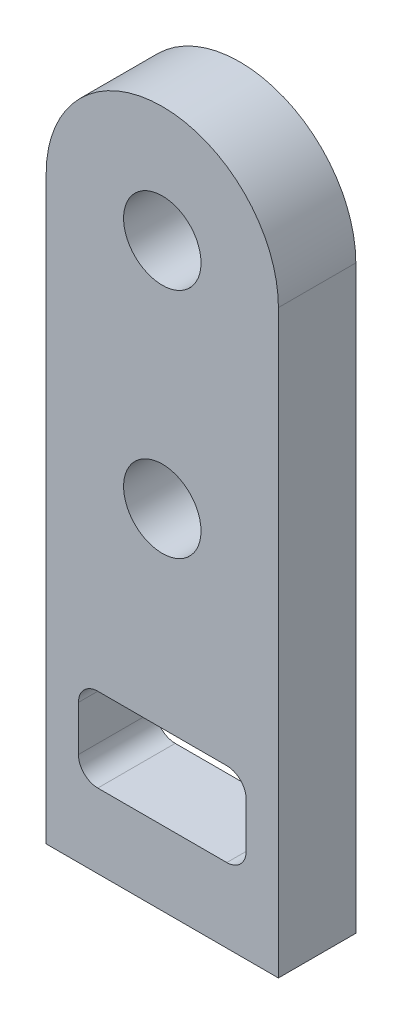
ISO-10303-21;
HEADER;
FILE_DESCRIPTION(('STEP AP214'),'2;1');
FILE_NAME('part.step','',(''),(''),'','','');
FILE_SCHEMA(('AUTOMOTIVE_DESIGN { 1 0 10303 214 1 1 1 1 }'));
ENDSEC;
DATA;
#1=APPLICATION_CONTEXT('core data for automotive mechanical design processes');
#2=APPLICATION_PROTOCOL_DEFINITION('international standard','automotive_design',2000,#1);
#3=PRODUCT_CONTEXT('',#1,'mechanical');
#4=PRODUCT('Part','Part','',(#3));
#5=PRODUCT_RELATED_PRODUCT_CATEGORY('part','',(#4));
#6=PRODUCT_DEFINITION_FORMATION('','',#4);
#7=PRODUCT_DEFINITION_CONTEXT('part definition',#1,'design');
#8=PRODUCT_DEFINITION('design','',#6,#7);
#9=PRODUCT_DEFINITION_SHAPE('','',#8);
#10=(LENGTH_UNIT() NAMED_UNIT(*) SI_UNIT(.MILLI.,.METRE.));
#11=(NAMED_UNIT(*) PLANE_ANGLE_UNIT() SI_UNIT($,.RADIAN.));
#12=(NAMED_UNIT(*) SI_UNIT($,.STERADIAN.) SOLID_ANGLE_UNIT());
#13=UNCERTAINTY_MEASURE_WITH_UNIT(LENGTH_MEASURE(1.E-05),#10,'distance_accuracy_value','');
#14=(GEOMETRIC_REPRESENTATION_CONTEXT(3) GLOBAL_UNCERTAINTY_ASSIGNED_CONTEXT((#13)) GLOBAL_UNIT_ASSIGNED_CONTEXT((#10,
#11,#12)) REPRESENTATION_CONTEXT('',''));
#15=CARTESIAN_POINT('',(0.,0.,0.));
#16=DIRECTION('',(0.,0.,1.));
#17=DIRECTION('',(1.,0.,0.));
#18=AXIS2_PLACEMENT_3D('',#15,#16,#17);
#19=CARTESIAN_POINT('',(155.0913565475,221.4940368431,3.));
#20=DIRECTION('',(0.,0.,1.));
#21=DIRECTION('',(1.,0.,0.));
#22=AXIS2_PLACEMENT_3D('',#19,#20,#21);
#23=PLANE('',#22);
#24=DIRECTION('',(1.,0.,0.));
#25=VECTOR('',#24,1.);
#26=CARTESIAN_POINT('',(157.5913565475,201.8690368431,3.));
#27=LINE('',#26,#25);
#28=CARTESIAN_POINT('',(152.5913565475,201.8690368431,3.));
#29=VERTEX_POINT('',#28);
#30=CARTESIAN_POINT('',(157.5913565475,201.8690368431,3.));
#31=VERTEX_POINT('',#30);
#32=EDGE_CURVE('E130',#29,#31,#27,.T.);
#33=ORIENTED_EDGE('',*,*,#32,.F.);
#34=CARTESIAN_POINT('',(152.5913565475,202.6190368431,3.));
#35=DIRECTION('',(0.,0.,1.));
#36=DIRECTION('',(1.,0.,0.));
#37=AXIS2_PLACEMENT_3D('',#34,#35,#36);
#38=CIRCLE('',#37,0.750000000000001);
#39=CARTESIAN_POINT('',(151.8413565475,202.6190368431,3.));
#40=VERTEX_POINT('',#39);
#41=EDGE_CURVE('E122',#40,#29,#38,.T.);
#42=ORIENTED_EDGE('',*,*,#41,.F.);
#43=DIRECTION('',(0.,-1.,0.));
#44=VECTOR('',#43,1.);
#45=CARTESIAN_POINT('',(151.8413565475,202.6190368431,3.));
#46=LINE('',#45,#44);
#47=CARTESIAN_POINT('',(151.8413565475,204.3690368431,3.));
#48=VERTEX_POINT('',#47);
#49=EDGE_CURVE('E157',#48,#40,#46,.T.);
#50=ORIENTED_EDGE('',*,*,#49,.F.);
#51=CARTESIAN_POINT('',(152.5913565475,204.3690368431,3.));
#52=DIRECTION('',(0.,0.,1.));
#53=DIRECTION('',(1.,0.,0.));
#54=AXIS2_PLACEMENT_3D('',#51,#52,#53);
#55=CIRCLE('',#54,0.750000000000001);
#56=CARTESIAN_POINT('',(152.5913565475,205.1190368431,3.));
#57=VERTEX_POINT('',#56);
#58=EDGE_CURVE('E155',#57,#48,#55,.T.);
#59=ORIENTED_EDGE('',*,*,#58,.F.);
#60=DIRECTION('',(-1.,0.,0.));
#61=VECTOR('',#60,1.);
#62=CARTESIAN_POINT('',(152.5913565475,205.1190368431,3.));
#63=LINE('',#62,#61);
#64=CARTESIAN_POINT('',(157.5913565475,205.1190368431,3.));
#65=VERTEX_POINT('',#64);
#66=EDGE_CURVE('E153',#65,#57,#63,.T.);
#67=ORIENTED_EDGE('',*,*,#66,.F.);
#68=CARTESIAN_POINT('',(157.5913565475,204.3690368431,3.));
#69=DIRECTION('',(0.,0.,1.));
#70=DIRECTION('',(1.,0.,0.));
#71=AXIS2_PLACEMENT_3D('',#68,#69,#70);
#72=CIRCLE('',#71,0.750000000000001);
#73=CARTESIAN_POINT('',(158.3413565475,204.3690368431,3.));
#74=VERTEX_POINT('',#73);
#75=EDGE_CURVE('E151',#74,#65,#72,.T.);
#76=ORIENTED_EDGE('',*,*,#75,.F.);
#77=DIRECTION('',(0.,1.,0.));
#78=VECTOR('',#77,1.);
#79=CARTESIAN_POINT('',(158.3413565475,204.3690368431,3.));
#80=LINE('',#79,#78);
#81=CARTESIAN_POINT('',(158.3413565475,202.6190368431,3.));
#82=VERTEX_POINT('',#81);
#83=EDGE_CURVE('E146',#82,#74,#80,.T.);
#84=ORIENTED_EDGE('',*,*,#83,.F.);
#85=CARTESIAN_POINT('',(157.5913565475,202.6190368431,3.));
#86=DIRECTION('',(0.,0.,1.));
#87=DIRECTION('',(1.,0.,0.));
#88=AXIS2_PLACEMENT_3D('',#85,#86,#87);
#89=CIRCLE('',#88,0.750000000000001);
#90=EDGE_CURVE('E144',#31,#82,#89,.T.);
#91=ORIENTED_EDGE('',*,*,#90,.F.);
#92=EDGE_LOOP('',(#33,#42,#50,#59,#67,#76,#84,#91));
#93=FACE_BOUND('',#92,.T.);
#94=CARTESIAN_POINT('',(155.0913565475,221.4940368431,3.));
#95=DIRECTION('',(0.,0.,1.));
#96=DIRECTION('',(1.,0.,0.));
#97=AXIS2_PLACEMENT_3D('',#94,#95,#96);
#98=CIRCLE('',#97,4.5);
#99=CARTESIAN_POINT('',(159.5913565475,221.4940368431,3.));
#100=VERTEX_POINT('',#99);
#101=CARTESIAN_POINT('',(150.5913565475,221.4940368431,3.));
#102=VERTEX_POINT('',#101);
#103=EDGE_CURVE('E196',#100,#102,#98,.T.);
#104=ORIENTED_EDGE('',*,*,#103,.T.);
#105=DIRECTION('',(0.,-1.,0.));
#106=VECTOR('',#105,1.);
#107=CARTESIAN_POINT('',(150.5913565475,198.9940368431,3.));
#108=LINE('',#107,#106);
#109=CARTESIAN_POINT('',(150.5913565475,198.9940368431,3.));
#110=VERTEX_POINT('',#109);
#111=EDGE_CURVE('E199',#102,#110,#108,.T.);
#112=ORIENTED_EDGE('',*,*,#111,.T.);
#113=DIRECTION('',(1.,0.,0.));
#114=VECTOR('',#113,1.);
#115=CARTESIAN_POINT('',(159.5913565475,198.9940368431,3.));
#116=LINE('',#115,#114);
#117=CARTESIAN_POINT('',(159.5913565475,198.9940368431,3.));
#118=VERTEX_POINT('',#117);
#119=EDGE_CURVE('E202',#110,#118,#116,.T.);
#120=ORIENTED_EDGE('',*,*,#119,.T.);
#121=DIRECTION('',(0.,1.,0.));
#122=VECTOR('',#121,1.);
#123=CARTESIAN_POINT('',(159.5913565475,221.4940368431,3.));
#124=LINE('',#123,#122);
#125=EDGE_CURVE('E204',#118,#100,#124,.T.);
#126=ORIENTED_EDGE('',*,*,#125,.T.);
#127=EDGE_LOOP('',(#104,#112,#120,#126));
#128=FACE_BOUND('',#127,.T.);
#129=CARTESIAN_POINT('',(155.0913565475,221.4940368431,3.));
#130=DIRECTION('',(0.,0.,1.));
#131=DIRECTION('',(1.,0.,0.));
#132=AXIS2_PLACEMENT_3D('',#129,#130,#131);
#133=CIRCLE('',#132,1.5);
#134=CARTESIAN_POINT('',(156.5913565475,221.4940368431,3.));
#135=VERTEX_POINT('',#134);
#136=EDGE_CURVE('E190',#135,#135,#133,.T.);
#137=ORIENTED_EDGE('',*,*,#136,.F.);
#138=EDGE_LOOP('',(#137));
#139=FACE_BOUND('',#138,.T.);
#140=CARTESIAN_POINT('',(155.0913565475,212.4940368431,3.));
#141=DIRECTION('',(0.,0.,1.));
#142=DIRECTION('',(1.,0.,0.));
#143=AXIS2_PLACEMENT_3D('',#140,#141,#142);
#144=CIRCLE('',#143,1.5);
#145=CARTESIAN_POINT('',(156.5913565475,212.4940368431,3.));
#146=VERTEX_POINT('',#145);
#147=EDGE_CURVE('E160',#146,#146,#144,.T.);
#148=ORIENTED_EDGE('',*,*,#147,.F.);
#149=EDGE_LOOP('',(#148));
#150=FACE_BOUND('',#149,.T.);
#151=ADVANCED_FACE('F33',(#93,#128,#139,#150),#23,.T.);
#152=CARTESIAN_POINT('',(155.0913565475,221.4940368431,0.));
#153=DIRECTION('',(0.,0.,1.));
#154=DIRECTION('',(1.,0.,0.));
#155=AXIS2_PLACEMENT_3D('',#152,#153,#154);
#156=PLANE('',#155);
#157=CARTESIAN_POINT('',(152.5913565475,202.6190368431,0.));
#158=DIRECTION('',(0.,0.,1.));
#159=DIRECTION('',(1.,0.,0.));
#160=AXIS2_PLACEMENT_3D('',#157,#158,#159);
#161=CIRCLE('',#160,0.750000000000001);
#162=CARTESIAN_POINT('',(151.8413565475,202.6190368431,0.));
#163=VERTEX_POINT('',#162);
#164=CARTESIAN_POINT('',(152.5913565475,201.8690368431,0.));
#165=VERTEX_POINT('',#164);
#166=EDGE_CURVE('E56',#163,#165,#161,.T.);
#167=ORIENTED_EDGE('',*,*,#166,.T.);
#168=DIRECTION('',(1.,0.,0.));
#169=VECTOR('',#168,1.);
#170=CARTESIAN_POINT('',(157.5913565475,201.8690368431,0.));
#171=LINE('',#170,#169);
#172=CARTESIAN_POINT('',(157.5913565475,201.8690368431,0.));
#173=VERTEX_POINT('',#172);
#174=EDGE_CURVE('E137',#165,#173,#171,.T.);
#175=ORIENTED_EDGE('',*,*,#174,.T.);
#176=CARTESIAN_POINT('',(157.5913565475,202.6190368431,0.));
#177=DIRECTION('',(0.,0.,1.));
#178=DIRECTION('',(1.,0.,0.));
#179=AXIS2_PLACEMENT_3D('',#176,#177,#178);
#180=CIRCLE('',#179,0.750000000000001);
#181=CARTESIAN_POINT('',(158.3413565475,202.6190368431,0.));
#182=VERTEX_POINT('',#181);
#183=EDGE_CURVE('E162',#173,#182,#180,.T.);
#184=ORIENTED_EDGE('',*,*,#183,.T.);
#185=DIRECTION('',(0.,1.,0.));
#186=VECTOR('',#185,1.);
#187=CARTESIAN_POINT('',(158.3413565475,204.3690368431,0.));
#188=LINE('',#187,#186);
#189=CARTESIAN_POINT('',(158.3413565475,204.3690368431,0.));
#190=VERTEX_POINT('',#189);
#191=EDGE_CURVE('E165',#182,#190,#188,.T.);
#192=ORIENTED_EDGE('',*,*,#191,.T.);
#193=CARTESIAN_POINT('',(157.5913565475,204.3690368431,0.));
#194=DIRECTION('',(0.,0.,1.));
#195=DIRECTION('',(1.,0.,0.));
#196=AXIS2_PLACEMENT_3D('',#193,#194,#195);
#197=CIRCLE('',#196,0.750000000000001);
#198=CARTESIAN_POINT('',(157.5913565475,205.1190368431,0.));
#199=VERTEX_POINT('',#198);
#200=EDGE_CURVE('E168',#190,#199,#197,.T.);
#201=ORIENTED_EDGE('',*,*,#200,.T.);
#202=DIRECTION('',(-1.,0.,0.));
#203=VECTOR('',#202,1.);
#204=CARTESIAN_POINT('',(152.5913565475,205.1190368431,0.));
#205=LINE('',#204,#203);
#206=CARTESIAN_POINT('',(152.5913565475,205.1190368431,0.));
#207=VERTEX_POINT('',#206);
#208=EDGE_CURVE('E171',#199,#207,#205,.T.);
#209=ORIENTED_EDGE('',*,*,#208,.T.);
#210=CARTESIAN_POINT('',(152.5913565475,204.3690368431,0.));
#211=DIRECTION('',(0.,0.,1.));
#212=DIRECTION('',(1.,0.,0.));
#213=AXIS2_PLACEMENT_3D('',#210,#211,#212);
#214=CIRCLE('',#213,0.750000000000001);
#215=CARTESIAN_POINT('',(151.8413565475,204.3690368431,0.));
#216=VERTEX_POINT('',#215);
#217=EDGE_CURVE('E174',#207,#216,#214,.T.);
#218=ORIENTED_EDGE('',*,*,#217,.T.);
#219=DIRECTION('',(0.,-1.,0.));
#220=VECTOR('',#219,1.);
#221=CARTESIAN_POINT('',(151.8413565475,202.6190368431,0.));
#222=LINE('',#221,#220);
#223=EDGE_CURVE('E131',#216,#163,#222,.T.);
#224=ORIENTED_EDGE('',*,*,#223,.T.);
#225=EDGE_LOOP('',(#167,#175,#184,#192,#201,#209,#218,#224));
#226=FACE_BOUND('',#225,.T.);
#227=CARTESIAN_POINT('',(155.0913565475,221.4940368431,0.));
#228=DIRECTION('',(0.,0.,1.));
#229=DIRECTION('',(1.,0.,0.));
#230=AXIS2_PLACEMENT_3D('',#227,#228,#229);
#231=CIRCLE('',#230,4.5);
#232=CARTESIAN_POINT('',(159.5913565475,221.4940368431,0.));
#233=VERTEX_POINT('',#232);
#234=CARTESIAN_POINT('',(150.5913565475,221.4940368431,0.));
#235=VERTEX_POINT('',#234);
#236=EDGE_CURVE('E193',#233,#235,#231,.T.);
#237=ORIENTED_EDGE('',*,*,#236,.F.);
#238=DIRECTION('',(0.,1.,0.));
#239=VECTOR('',#238,1.);
#240=CARTESIAN_POINT('',(159.5913565475,221.4940368431,0.));
#241=LINE('',#240,#239);
#242=CARTESIAN_POINT('',(159.5913565475,198.9940368431,0.));
#243=VERTEX_POINT('',#242);
#244=EDGE_CURVE('E200',#243,#233,#241,.T.);
#245=ORIENTED_EDGE('',*,*,#244,.F.);
#246=DIRECTION('',(1.,0.,0.));
#247=VECTOR('',#246,1.);
#248=CARTESIAN_POINT('',(159.5913565475,198.9940368431,0.));
#249=LINE('',#248,#247);
#250=CARTESIAN_POINT('',(150.5913565475,198.9940368431,0.));
#251=VERTEX_POINT('',#250);
#252=EDGE_CURVE('E211',#251,#243,#249,.T.);
#253=ORIENTED_EDGE('',*,*,#252,.F.);
#254=DIRECTION('',(0.,-1.,0.));
#255=VECTOR('',#254,1.);
#256=CARTESIAN_POINT('',(150.5913565475,198.9940368431,0.));
#257=LINE('',#256,#255);
#258=EDGE_CURVE('E209',#235,#251,#257,.T.);
#259=ORIENTED_EDGE('',*,*,#258,.F.);
#260=EDGE_LOOP('',(#237,#245,#253,#259));
#261=FACE_BOUND('',#260,.T.);
#262=CARTESIAN_POINT('',(155.0913565475,221.4940368431,0.));
#263=DIRECTION('',(0.,0.,1.));
#264=DIRECTION('',(1.,0.,0.));
#265=AXIS2_PLACEMENT_3D('',#262,#263,#264);
#266=CIRCLE('',#265,1.5);
#267=CARTESIAN_POINT('',(156.5913565475,221.4940368431,0.));
#268=VERTEX_POINT('',#267);
#269=EDGE_CURVE('E138',#268,#268,#266,.T.);
#270=ORIENTED_EDGE('',*,*,#269,.T.);
#271=EDGE_LOOP('',(#270));
#272=FACE_BOUND('',#271,.T.);
#273=CARTESIAN_POINT('',(155.0913565475,212.4940368431,0.));
#274=DIRECTION('',(0.,0.,1.));
#275=DIRECTION('',(1.,0.,0.));
#276=AXIS2_PLACEMENT_3D('',#273,#274,#275);
#277=CIRCLE('',#276,1.5);
#278=CARTESIAN_POINT('',(156.5913565475,212.4940368431,0.));
#279=VERTEX_POINT('',#278);
#280=EDGE_CURVE('E271',#279,#279,#277,.T.);
#281=ORIENTED_EDGE('',*,*,#280,.T.);
#282=EDGE_LOOP('',(#281));
#283=FACE_BOUND('',#282,.T.);
#284=ADVANCED_FACE('F229',(#226,#261,#272,#283),#156,.F.);
#285=CARTESIAN_POINT('',(155.0913565475,221.4940368431,3.));
#286=DIRECTION('',(0.,0.,-1.));
#287=DIRECTION('',(-1.,0.,0.));
#288=AXIS2_PLACEMENT_3D('',#285,#286,#287);
#289=CYLINDRICAL_SURFACE('',#288,4.5);
#290=ORIENTED_EDGE('',*,*,#236,.T.);
#291=DIRECTION('',(0.,0.,-1.));
#292=VECTOR('',#291,1.);
#293=CARTESIAN_POINT('',(150.5913565475,221.4940368431,3.));
#294=LINE('',#293,#292);
#295=EDGE_CURVE('E11',#102,#235,#294,.T.);
#296=ORIENTED_EDGE('',*,*,#295,.F.);
#297=ORIENTED_EDGE('',*,*,#103,.F.);
#298=DIRECTION('',(0.,0.,-1.));
#299=VECTOR('',#298,1.);
#300=CARTESIAN_POINT('',(159.5913565475,221.4940368431,3.));
#301=LINE('',#300,#299);
#302=EDGE_CURVE('E206',#100,#233,#301,.T.);
#303=ORIENTED_EDGE('',*,*,#302,.T.);
#304=EDGE_LOOP('',(#290,#296,#297,#303));
#305=FACE_BOUND('',#304,.T.);
#306=ADVANCED_FACE('F35',(#305),#289,.T.);
#307=CARTESIAN_POINT('',(150.5913565475,198.9940368431,3.));
#308=DIRECTION('',(1.,0.,0.));
#309=DIRECTION('',(0.,0.,-1.));
#310=AXIS2_PLACEMENT_3D('',#307,#308,#309);
#311=PLANE('',#310);
#312=ORIENTED_EDGE('',*,*,#258,.T.);
#313=DIRECTION('',(0.,0.,-1.));
#314=VECTOR('',#313,1.);
#315=CARTESIAN_POINT('',(150.5913565475,198.9940368431,3.));
#316=LINE('',#315,#314);
#317=EDGE_CURVE('E41',#110,#251,#316,.T.);
#318=ORIENTED_EDGE('',*,*,#317,.F.);
#319=ORIENTED_EDGE('',*,*,#111,.F.);
#320=ORIENTED_EDGE('',*,*,#295,.T.);
#321=EDGE_LOOP('',(#312,#318,#319,#320));
#322=FACE_BOUND('',#321,.T.);
#323=ADVANCED_FACE('F239',(#322),#311,.F.);
#324=CARTESIAN_POINT('',(159.5913565475,198.9940368431,3.));
#325=DIRECTION('',(0.,1.,0.));
#326=DIRECTION('',(0.,0.,1.));
#327=AXIS2_PLACEMENT_3D('',#324,#325,#326);
#328=PLANE('',#327);
#329=ORIENTED_EDGE('',*,*,#252,.T.);
#330=DIRECTION('',(0.,0.,-1.));
#331=VECTOR('',#330,1.);
#332=CARTESIAN_POINT('',(159.5913565475,198.9940368431,3.));
#333=LINE('',#332,#331);
#334=EDGE_CURVE('E216',#118,#243,#333,.T.);
#335=ORIENTED_EDGE('',*,*,#334,.F.);
#336=ORIENTED_EDGE('',*,*,#119,.F.);
#337=ORIENTED_EDGE('',*,*,#317,.T.);
#338=EDGE_LOOP('',(#329,#335,#336,#337));
#339=FACE_BOUND('',#338,.T.);
#340=ADVANCED_FACE('F223',(#339),#328,.F.);
#341=CARTESIAN_POINT('',(159.5913565475,221.4940368431,3.));
#342=DIRECTION('',(-1.,0.,0.));
#343=DIRECTION('',(0.,0.,1.));
#344=AXIS2_PLACEMENT_3D('',#341,#342,#343);
#345=PLANE('',#344);
#346=ORIENTED_EDGE('',*,*,#244,.T.);
#347=ORIENTED_EDGE('',*,*,#302,.F.);
#348=ORIENTED_EDGE('',*,*,#125,.F.);
#349=ORIENTED_EDGE('',*,*,#334,.T.);
#350=EDGE_LOOP('',(#346,#347,#348,#349));
#351=FACE_BOUND('',#350,.T.);
#352=ADVANCED_FACE('F233',(#351),#345,.F.);
#353=CARTESIAN_POINT('',(155.0913565475,221.4940368431,3.));
#354=DIRECTION('',(0.,0.,-1.));
#355=DIRECTION('',(-1.,0.,0.));
#356=AXIS2_PLACEMENT_3D('',#353,#354,#355);
#357=CYLINDRICAL_SURFACE('',#356,1.5);
#358=ORIENTED_EDGE('',*,*,#136,.T.);
#359=EDGE_LOOP('',(#358));
#360=FACE_BOUND('',#359,.T.);
#361=ORIENTED_EDGE('',*,*,#269,.F.);
#362=EDGE_LOOP('',(#361));
#363=FACE_BOUND('',#362,.T.);
#364=ADVANCED_FACE('F254',(#360,#363),#357,.F.);
#365=CARTESIAN_POINT('',(152.5913565475,202.6190368431,3.));
#366=DIRECTION('',(0.,0.,-1.));
#367=DIRECTION('',(-1.,0.,0.));
#368=AXIS2_PLACEMENT_3D('',#365,#366,#367);
#369=CYLINDRICAL_SURFACE('',#368,0.750000000000001);
#370=ORIENTED_EDGE('',*,*,#166,.F.);
#371=DIRECTION('',(0.,0.,-1.));
#372=VECTOR('',#371,1.);
#373=CARTESIAN_POINT('',(151.8413565475,202.6190368431,3.));
#374=LINE('',#373,#372);
#375=EDGE_CURVE('E126',#40,#163,#374,.T.);
#376=ORIENTED_EDGE('',*,*,#375,.F.);
#377=ORIENTED_EDGE('',*,*,#41,.T.);
#378=DIRECTION('',(0.,0.,-1.));
#379=VECTOR('',#378,1.);
#380=CARTESIAN_POINT('',(152.5913565475,201.8690368431,3.));
#381=LINE('',#380,#379);
#382=EDGE_CURVE('E125',#29,#165,#381,.T.);
#383=ORIENTED_EDGE('',*,*,#382,.T.);
#384=EDGE_LOOP('',(#370,#376,#377,#383));
#385=FACE_BOUND('',#384,.T.);
#386=ADVANCED_FACE('F124',(#385),#369,.F.);
#387=CARTESIAN_POINT('',(157.5913565475,201.8690368431,3.));
#388=DIRECTION('',(0.,1.,0.));
#389=DIRECTION('',(0.,0.,1.));
#390=AXIS2_PLACEMENT_3D('',#387,#388,#389);
#391=PLANE('',#390);
#392=ORIENTED_EDGE('',*,*,#174,.F.);
#393=ORIENTED_EDGE('',*,*,#382,.F.);
#394=ORIENTED_EDGE('',*,*,#32,.T.);
#395=DIRECTION('',(0.,0.,-1.));
#396=VECTOR('',#395,1.);
#397=CARTESIAN_POINT('',(157.5913565475,201.8690368431,3.));
#398=LINE('',#397,#396);
#399=EDGE_CURVE('E139',#31,#173,#398,.T.);
#400=ORIENTED_EDGE('',*,*,#399,.T.);
#401=EDGE_LOOP('',(#392,#393,#394,#400));
#402=FACE_BOUND('',#401,.T.);
#403=ADVANCED_FACE('F134',(#402),#391,.T.);
#404=CARTESIAN_POINT('',(157.5913565475,202.6190368431,3.));
#405=DIRECTION('',(0.,0.,-1.));
#406=DIRECTION('',(-1.,0.,0.));
#407=AXIS2_PLACEMENT_3D('',#404,#405,#406);
#408=CYLINDRICAL_SURFACE('',#407,0.750000000000001);
#409=ORIENTED_EDGE('',*,*,#183,.F.);
#410=ORIENTED_EDGE('',*,*,#399,.F.);
#411=ORIENTED_EDGE('',*,*,#90,.T.);
#412=DIRECTION('',(0.,0.,-1.));
#413=VECTOR('',#412,1.);
#414=CARTESIAN_POINT('',(158.3413565475,202.6190368431,3.));
#415=LINE('',#414,#413);
#416=EDGE_CURVE('E187',#82,#182,#415,.T.);
#417=ORIENTED_EDGE('',*,*,#416,.T.);
#418=EDGE_LOOP('',(#409,#410,#411,#417));
#419=FACE_BOUND('',#418,.T.);
#420=ADVANCED_FACE('F302',(#419),#408,.F.);
#421=CARTESIAN_POINT('',(158.3413565475,204.3690368431,3.));
#422=DIRECTION('',(-1.,0.,0.));
#423=DIRECTION('',(0.,0.,1.));
#424=AXIS2_PLACEMENT_3D('',#421,#422,#423);
#425=PLANE('',#424);
#426=ORIENTED_EDGE('',*,*,#191,.F.);
#427=ORIENTED_EDGE('',*,*,#416,.F.);
#428=ORIENTED_EDGE('',*,*,#83,.T.);
#429=DIRECTION('',(0.,0.,-1.));
#430=VECTOR('',#429,1.);
#431=CARTESIAN_POINT('',(158.3413565475,204.3690368431,3.));
#432=LINE('',#431,#430);
#433=EDGE_CURVE('E185',#74,#190,#432,.T.);
#434=ORIENTED_EDGE('',*,*,#433,.T.);
#435=EDGE_LOOP('',(#426,#427,#428,#434));
#436=FACE_BOUND('',#435,.T.);
#437=ADVANCED_FACE('F298',(#436),#425,.T.);
#438=CARTESIAN_POINT('',(157.5913565475,204.3690368431,3.));
#439=DIRECTION('',(0.,0.,-1.));
#440=DIRECTION('',(-1.,0.,0.));
#441=AXIS2_PLACEMENT_3D('',#438,#439,#440);
#442=CYLINDRICAL_SURFACE('',#441,0.750000000000001);
#443=ORIENTED_EDGE('',*,*,#200,.F.);
#444=ORIENTED_EDGE('',*,*,#433,.F.);
#445=ORIENTED_EDGE('',*,*,#75,.T.);
#446=DIRECTION('',(0.,0.,-1.));
#447=VECTOR('',#446,1.);
#448=CARTESIAN_POINT('',(157.5913565475,205.1190368431,3.));
#449=LINE('',#448,#447);
#450=EDGE_CURVE('E183',#65,#199,#449,.T.);
#451=ORIENTED_EDGE('',*,*,#450,.T.);
#452=EDGE_LOOP('',(#443,#444,#445,#451));
#453=FACE_BOUND('',#452,.T.);
#454=ADVANCED_FACE('F294',(#453),#442,.F.);
#455=CARTESIAN_POINT('',(152.5913565475,205.1190368431,3.));
#456=DIRECTION('',(0.,-1.,0.));
#457=DIRECTION('',(0.,0.,-1.));
#458=AXIS2_PLACEMENT_3D('',#455,#456,#457);
#459=PLANE('',#458);
#460=ORIENTED_EDGE('',*,*,#208,.F.);
#461=ORIENTED_EDGE('',*,*,#450,.F.);
#462=ORIENTED_EDGE('',*,*,#66,.T.);
#463=DIRECTION('',(0.,0.,-1.));
#464=VECTOR('',#463,1.);
#465=CARTESIAN_POINT('',(152.5913565475,205.1190368431,3.));
#466=LINE('',#465,#464);
#467=EDGE_CURVE('E181',#57,#207,#466,.T.);
#468=ORIENTED_EDGE('',*,*,#467,.T.);
#469=EDGE_LOOP('',(#460,#461,#462,#468));
#470=FACE_BOUND('',#469,.T.);
#471=ADVANCED_FACE('F290',(#470),#459,.T.);
#472=CARTESIAN_POINT('',(152.5913565475,204.3690368431,3.));
#473=DIRECTION('',(0.,0.,-1.));
#474=DIRECTION('',(-1.,0.,0.));
#475=AXIS2_PLACEMENT_3D('',#472,#473,#474);
#476=CYLINDRICAL_SURFACE('',#475,0.750000000000001);
#477=ORIENTED_EDGE('',*,*,#217,.F.);
#478=ORIENTED_EDGE('',*,*,#467,.F.);
#479=ORIENTED_EDGE('',*,*,#58,.T.);
#480=DIRECTION('',(0.,0.,-1.));
#481=VECTOR('',#480,1.);
#482=CARTESIAN_POINT('',(151.8413565475,204.3690368431,3.));
#483=LINE('',#482,#481);
#484=EDGE_CURVE('E48',#48,#216,#483,.T.);
#485=ORIENTED_EDGE('',*,*,#484,.T.);
#486=EDGE_LOOP('',(#477,#478,#479,#485));
#487=FACE_BOUND('',#486,.T.);
#488=ADVANCED_FACE('F285',(#487),#476,.F.);
#489=CARTESIAN_POINT('',(151.8413565475,202.6190368431,3.));
#490=DIRECTION('',(1.,0.,0.));
#491=DIRECTION('',(0.,0.,-1.));
#492=AXIS2_PLACEMENT_3D('',#489,#490,#491);
#493=PLANE('',#492);
#494=ORIENTED_EDGE('',*,*,#223,.F.);
#495=ORIENTED_EDGE('',*,*,#484,.F.);
#496=ORIENTED_EDGE('',*,*,#49,.T.);
#497=ORIENTED_EDGE('',*,*,#375,.T.);
#498=EDGE_LOOP('',(#494,#495,#496,#497));
#499=FACE_BOUND('',#498,.T.);
#500=ADVANCED_FACE('F280',(#499),#493,.T.);
#501=CARTESIAN_POINT('',(155.0913565475,212.4940368431,3.));
#502=DIRECTION('',(0.,0.,-1.));
#503=DIRECTION('',(-1.,0.,0.));
#504=AXIS2_PLACEMENT_3D('',#501,#502,#503);
#505=CYLINDRICAL_SURFACE('',#504,1.5);
#506=ORIENTED_EDGE('',*,*,#147,.T.);
#507=EDGE_LOOP('',(#506));
#508=FACE_BOUND('',#507,.T.);
#509=ORIENTED_EDGE('',*,*,#280,.F.);
#510=EDGE_LOOP('',(#509));
#511=FACE_BOUND('',#510,.T.);
#512=ADVANCED_FACE('F277',(#508,#511),#505,.F.);
#513=CLOSED_SHELL('',(#151,#284,#306,#323,#340,#352,#364,#386,#403,#420,#437,#454,#471,#488,
#500,#512));
#514=MANIFOLD_SOLID_BREP('B2',#513);
#515=ADVANCED_BREP_SHAPE_REPRESENTATION('',(#18,#514),#14);
#516=SHAPE_DEFINITION_REPRESENTATION(#9,#515);
ENDSEC;
END-ISO-10303-21;
